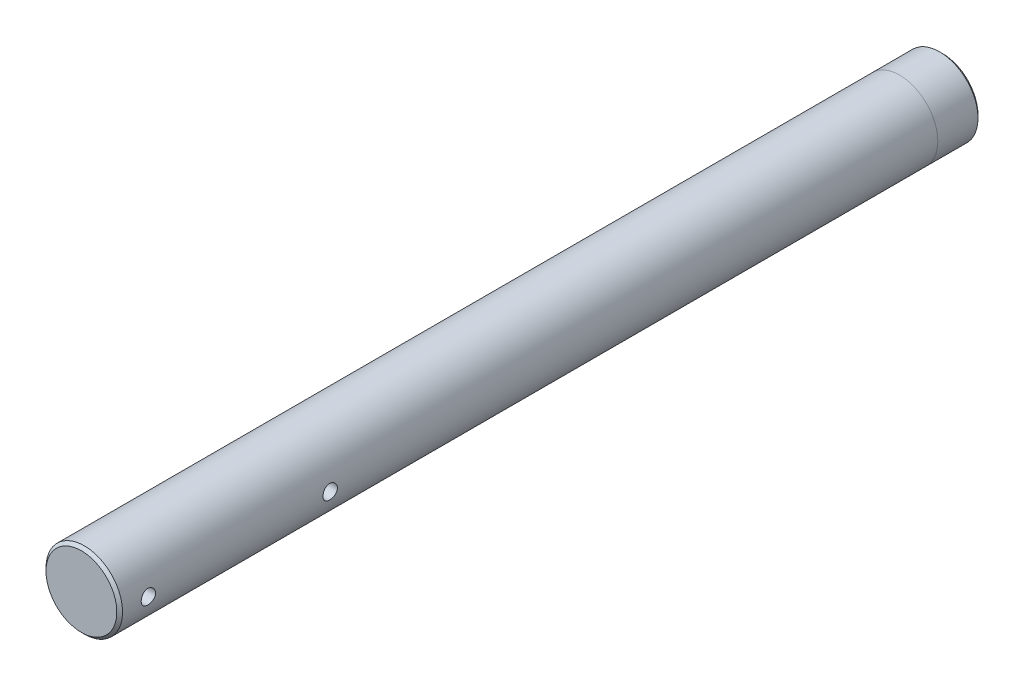
ISO-10303-21;
HEADER;
FILE_DESCRIPTION(('STEP AP214'),'2;1');
FILE_NAME('part.step','',(''),(''),'','','');
FILE_SCHEMA(('AUTOMOTIVE_DESIGN { 1 0 10303 214 1 1 1 1 }'));
ENDSEC;
DATA;
#1=APPLICATION_CONTEXT('core data for automotive mechanical design processes');
#2=APPLICATION_PROTOCOL_DEFINITION('international standard','automotive_design',2000,#1);
#3=PRODUCT_CONTEXT('',#1,'mechanical');
#4=PRODUCT('Part','Part','',(#3));
#5=PRODUCT_RELATED_PRODUCT_CATEGORY('part','',(#4));
#6=PRODUCT_DEFINITION_FORMATION('','',#4);
#7=PRODUCT_DEFINITION_CONTEXT('part definition',#1,'design');
#8=PRODUCT_DEFINITION('design','',#6,#7);
#9=PRODUCT_DEFINITION_SHAPE('','',#8);
#10=(LENGTH_UNIT() NAMED_UNIT(*) SI_UNIT(.MILLI.,.METRE.));
#11=(NAMED_UNIT(*) PLANE_ANGLE_UNIT() SI_UNIT($,.RADIAN.));
#12=(NAMED_UNIT(*) SI_UNIT($,.STERADIAN.) SOLID_ANGLE_UNIT());
#13=UNCERTAINTY_MEASURE_WITH_UNIT(LENGTH_MEASURE(1.E-05),#10,'distance_accuracy_value','');
#14=(GEOMETRIC_REPRESENTATION_CONTEXT(3) GLOBAL_UNCERTAINTY_ASSIGNED_CONTEXT((#13)) GLOBAL_UNIT_ASSIGNED_CONTEXT((#10,
#11,#12)) REPRESENTATION_CONTEXT('',''));
#15=CARTESIAN_POINT('',(0.,0.,0.));
#16=DIRECTION('',(0.,0.,1.));
#17=DIRECTION('',(1.,0.,0.));
#18=AXIS2_PLACEMENT_3D('',#15,#16,#17);
#19=CARTESIAN_POINT('',(0.,0.,0.));
#20=DIRECTION('',(0.,0.,1.));
#21=DIRECTION('',(1.,0.,0.));
#22=AXIS2_PLACEMENT_3D('',#19,#20,#21);
#23=CYLINDRICAL_SURFACE('',#22,4.00000000000001);
#24=CARTESIAN_POINT('',(0.,0.,44.7));
#25=DIRECTION('',(0.,0.,-1.));
#26=DIRECTION('',(-1.,0.,0.));
#27=AXIS2_PLACEMENT_3D('',#24,#25,#26);
#28=CIRCLE('',#27,4.00000000000001);
#29=CARTESIAN_POINT('',(-4.00000000000001,0.,44.7));
#30=VERTEX_POINT('',#29);
#31=EDGE_CURVE('E99',#30,#30,#28,.T.);
#32=ORIENTED_EDGE('',*,*,#31,.T.);
#33=EDGE_LOOP('',(#32));
#34=FACE_BOUND('',#33,.T.);
#35=CARTESIAN_POINT('',(4.00000000000001,0.,22.25));
#36=CARTESIAN_POINT('',(3.99999924416926,-0.0417358732327353,22.2500015947941));
#37=CARTESIAN_POINT('',(3.99934004960858,-0.0834924963650491,22.2534955383097));
#38=CARTESIAN_POINT('',(3.99677392945261,-0.165829064920898,22.2673699975592));
#39=CARTESIAN_POINT('',(3.99486595083449,-0.206407987076112,22.2777563253199));
#40=CARTESIAN_POINT('',(3.9900156938273,-0.2851864809259,22.3050863506297));
#41=CARTESIAN_POINT('',(3.98707434973242,-0.323388165342672,22.3220241262263));
#42=CARTESIAN_POINT('',(3.98047855299892,-0.396403986547004,22.3619594384614));
#43=CARTESIAN_POINT('',(3.97682415809145,-0.431218397238661,22.3849564845724));
#44=CARTESIAN_POINT('',(3.96915668215253,-0.49689185796525,22.4366498840018));
#45=CARTESIAN_POINT('',(3.96514017428176,-0.527704477515915,22.4654047223351));
#46=CARTESIAN_POINT('',(3.95722659229326,-0.584098030676846,22.5276716545438));
#47=CARTESIAN_POINT('',(3.95332952677264,-0.609678588446208,22.5611840898846));
#48=CARTESIAN_POINT('',(3.94606275622503,-0.655074993328966,22.632343044182));
#49=CARTESIAN_POINT('',(3.94269746943092,-0.67484360984803,22.6700201851586));
#50=CARTESIAN_POINT('',(3.93692356605994,-0.70775262166142,22.7482344575884));
#51=CARTESIAN_POINT('',(3.93451486698482,-0.720893588565495,22.7887713420556));
#52=CARTESIAN_POINT('',(3.93096134787275,-0.740025267517506,22.8710576154572));
#53=CARTESIAN_POINT('',(3.92980222683203,-0.7460969509602,22.9127875486017));
#54=CARTESIAN_POINT('',(3.92883598576381,-0.751169040476738,22.9966886924041));
#55=CARTESIAN_POINT('',(3.9290287444938,-0.750170080676877,23.0388598631511));
#56=CARTESIAN_POINT('',(3.93073146350877,-0.74119489801182,23.121859762633));
#57=CARTESIAN_POINT('',(3.93222404073667,-0.733310749980232,23.1626988571501));
#58=CARTESIAN_POINT('',(3.93633091642334,-0.710933996981044,23.2424642098913));
#59=CARTESIAN_POINT('',(3.93894526254758,-0.696441111197507,23.2813903867546));
#60=CARTESIAN_POINT('',(3.94501927646295,-0.66116823589651,23.3564943395001));
#61=CARTESIAN_POINT('',(3.94848391911683,-0.640351067662291,23.3926542352904));
#62=CARTESIAN_POINT('',(3.95586485801459,-0.593046844652095,23.4610023642701));
#63=CARTESIAN_POINT('',(3.95978120007761,-0.566559214446343,23.4931901938574));
#64=CARTESIAN_POINT('',(3.96770000636083,-0.508169528426502,23.5532124778362));
#65=CARTESIAN_POINT('',(3.97170285512016,-0.476188718430355,23.5809703262259));
#66=CARTESIAN_POINT('',(3.97928693054159,-0.407984018549427,23.6307386203377));
#67=CARTESIAN_POINT('',(3.98286815297623,-0.371760086127899,23.6527490084352));
#68=CARTESIAN_POINT('',(3.98921269838755,-0.296017494437348,23.690408876935));
#69=CARTESIAN_POINT('',(3.99197499568145,-0.256494782223261,23.7060503895589));
#70=CARTESIAN_POINT('',(3.9963625270136,-0.175319557699363,23.7304510465461));
#71=CARTESIAN_POINT('',(3.99798788183997,-0.13366727213891,23.7392109220227));
#72=CARTESIAN_POINT('',(3.99990180320991,-0.0500743264517097,23.7494930155091));
#73=CARTESIAN_POINT('',(4.0002097545614,-0.00814700631708466,23.7511201957649));
#74=CARTESIAN_POINT('',(3.99950771799115,0.075380624046075,23.7473722602262));
#75=CARTESIAN_POINT('',(3.99849779482216,0.116980950240176,23.7419974884674));
#76=CARTESIAN_POINT('',(3.99528555750204,0.198340786609091,23.7244854824083));
#77=CARTESIAN_POINT('',(3.99309261187016,0.238112130523015,23.7124013587311));
#78=CARTESIAN_POINT('',(3.9877592110625,0.3150643159123,23.6818711466106));
#79=CARTESIAN_POINT('',(3.98461869155668,0.352244981297535,23.6634246262171));
#80=CARTESIAN_POINT('',(3.97769015178834,0.423408335756591,23.6204609359202));
#81=CARTESIAN_POINT('',(3.97389543087282,0.457351638507544,23.5958796307316));
#82=CARTESIAN_POINT('',(3.96609671744856,0.520669161632256,23.5414309313188));
#83=CARTESIAN_POINT('',(3.96209270542344,0.550042954880417,23.5115630434993));
#84=CARTESIAN_POINT('',(3.95426237848726,0.603786479360223,23.4469138405443));
#85=CARTESIAN_POINT('',(3.95043912930129,0.628084581092866,23.4120725459373));
#86=CARTESIAN_POINT('',(3.94346492789267,0.670483375288918,23.3387411877381));
#87=CARTESIAN_POINT('',(3.94031395068676,0.688584298069606,23.3002512598148));
#88=CARTESIAN_POINT('',(3.93506512104787,0.717973367564102,23.2208970663787));
#89=CARTESIAN_POINT('',(3.9329622021844,0.729294343973919,23.1800453102203));
#90=CARTESIAN_POINT('',(3.93003601901208,0.744903396631166,23.0969763887393));
#91=CARTESIAN_POINT('',(3.92921261032896,0.74919226635353,23.0547593780148));
#92=CARTESIAN_POINT('',(3.92894599901929,0.750588810741764,22.9708758342793));
#93=CARTESIAN_POINT('',(3.92948107987147,0.747809475017485,22.9292112095215));
#94=CARTESIAN_POINT('',(3.9318230033,0.735395876894007,22.8469542889774));
#95=CARTESIAN_POINT('',(3.93362983827874,0.725761655446653,22.8063619867863));
#96=CARTESIAN_POINT('',(3.9383025401159,0.699959437916309,22.7274627576023));
#97=CARTESIAN_POINT('',(3.94116642297483,0.683803676986256,22.6891517043271));
#98=CARTESIAN_POINT('',(3.94763193775921,0.645429344561017,22.6157658728796));
#99=CARTESIAN_POINT('',(3.9512336218006,0.623210344740925,22.5806913235776));
#100=CARTESIAN_POINT('',(3.95883633053873,0.572947436697672,22.5142081599789));
#101=CARTESIAN_POINT('',(3.96284252676522,0.544821299321514,22.4828622937165));
#102=CARTESIAN_POINT('',(3.97076416959368,0.483713963371142,22.4252974187677));
#103=CARTESIAN_POINT('',(3.97467959513665,0.450731650945804,22.3990795895099));
#104=CARTESIAN_POINT('',(3.98201987984025,0.380492472535933,22.3522945236865));
#105=CARTESIAN_POINT('',(3.98544000495281,0.343199795320257,22.3317802857547));
#106=CARTESIAN_POINT('',(3.99135809690344,0.265645056826917,22.2973411816974));
#107=CARTESIAN_POINT('',(3.99385692939519,0.225385825852624,22.2834101264766));
#108=CARTESIAN_POINT('',(3.99714145353817,0.154173601412577,22.2653613427907));
#109=CARTESIAN_POINT('',(3.99820735439104,0.123636905125935,22.2596106848436));
#110=CARTESIAN_POINT('',(3.99963689977006,0.062070623557579,22.2519294689418));
#111=CARTESIAN_POINT('',(4.00000056214903,0.0310410508263548,22.2499988138721));
#112=CARTESIAN_POINT('',(4.00000000000001,0.,22.25));
#113=B_SPLINE_CURVE_WITH_KNOTS('',3,(#35,#36,#37,#38,#39,#40,#41,#42,#43,#44,#45,#46,#47,#48,
#49,#50,#51,#52,#53,#54,#55,#56,#57,#58,#59,#60,#61,#62,#63,#64,#65,#66,#67,#68,#69,#70,#71,#72,
#73,#74,#75,#76,#77,#78,#79,#80,#81,#82,#83,#84,#85,#86,#87,#88,#89,#90,#91,#92,#93,#94,#95,#96,
#97,#98,#99,#100,#101,#102,#103,#104,#105,#106,#107,#108,#109,#110,#111,#112),.UNSPECIFIED.,.T.,
.F.,(4,2,2,2,2,2,2,2,2,2,2,2,2,2,2,2,2,2,2,2,2,2,2,2,2,2,2,2,2,2,2,2,2,2,2,2,2,2,4),(0.,
0.125094100482461,0.250293821267725,0.375380635615452,0.500457326684451,0.626875590068147,
0.75330293141808,0.880730952521787,1.00814798155974,1.13409075722667,1.26002223793628,
1.38429500306382,1.50857304923393,1.63359631314764,1.75863227024929,1.88563884232038,
2.01264668772474,2.13981294160849,2.26696568336872,2.39224087038048,2.51750990232291,
2.64180116953913,2.76610087669015,2.89175889008853,3.01742864206548,3.14476718493648,
3.27210099477471,3.39881313909278,3.52551098473255,3.65019626115873,3.77488079270752,
3.89933248103845,4.0237929632771,4.15011684983189,4.27646975631127,4.40396024458156,
4.53133063465585,4.62437172262203,4.71741044519769),.UNSPECIFIED.);
#114=CARTESIAN_POINT('',(4.00000000000001,0.,22.25));
#115=VERTEX_POINT('',#114);
#116=EDGE_CURVE('E76',#115,#115,#113,.T.);
#117=ORIENTED_EDGE('',*,*,#116,.T.);
#118=EDGE_LOOP('',(#117));
#119=FACE_BOUND('',#118,.T.);
#120=CARTESIAN_POINT('',(-4.00000000000001,0.,22.25));
#121=CARTESIAN_POINT('',(-3.99999924416926,0.041735873232727,22.2500015947941));
#122=CARTESIAN_POINT('',(-3.99934004960858,0.0834924963650405,22.2534955383097));
#123=CARTESIAN_POINT('',(-3.99677392945261,0.16582906492089,22.2673699975592));
#124=CARTESIAN_POINT('',(-3.99486595083449,0.206407987076104,22.2777563253199));
#125=CARTESIAN_POINT('',(-3.9900156938273,0.285186480925891,22.3050863506297));
#126=CARTESIAN_POINT('',(-3.98707434973242,0.323388165342662,22.3220241262263));
#127=CARTESIAN_POINT('',(-3.98047855299892,0.396403986546993,22.3619594384614));
#128=CARTESIAN_POINT('',(-3.97682415809145,0.431218397238652,22.3849564845724));
#129=CARTESIAN_POINT('',(-3.96915668215253,0.496891857965241,22.4366498840018));
#130=CARTESIAN_POINT('',(-3.96514017428176,0.527704477515905,22.4654047223351));
#131=CARTESIAN_POINT('',(-3.95722659229326,0.584098030676835,22.5276716545438));
#132=CARTESIAN_POINT('',(-3.95332952677264,0.609678588446196,22.5611840898846));
#133=CARTESIAN_POINT('',(-3.94606275622503,0.655074993328953,22.632343044182));
#134=CARTESIAN_POINT('',(-3.94269746943092,0.674843609848016,22.6700201851586));
#135=CARTESIAN_POINT('',(-3.93692356605994,0.707752621661405,22.7482344575884));
#136=CARTESIAN_POINT('',(-3.93451486698482,0.72089358856548,22.7887713420556));
#137=CARTESIAN_POINT('',(-3.93096134787276,0.74002526751749,22.8710576154572));
#138=CARTESIAN_POINT('',(-3.92980222683203,0.746096950960185,22.9127875486017));
#139=CARTESIAN_POINT('',(-3.92883598576381,0.751169040476722,22.9966886924041));
#140=CARTESIAN_POINT('',(-3.92902874449381,0.75017008067686,23.0388598631511));
#141=CARTESIAN_POINT('',(-3.93073146350877,0.741194898011802,23.121859762633));
#142=CARTESIAN_POINT('',(-3.93222404073668,0.733310749980214,23.1626988571501));
#143=CARTESIAN_POINT('',(-3.93633091642334,0.710933996981024,23.2424642098913));
#144=CARTESIAN_POINT('',(-3.93894526254759,0.696441111197486,23.2813903867547));
#145=CARTESIAN_POINT('',(-3.94501927646295,0.661168235896488,23.3564943395001));
#146=CARTESIAN_POINT('',(-3.94848391911684,0.640351067662268,23.3926542352904));
#147=CARTESIAN_POINT('',(-3.9558648580146,0.59304684465207,23.4610023642701));
#148=CARTESIAN_POINT('',(-3.95978120007762,0.566559214446319,23.4931901938574));
#149=CARTESIAN_POINT('',(-3.96770000636083,0.508169528426478,23.5532124778362));
#150=CARTESIAN_POINT('',(-3.97170285512016,0.476188718430331,23.5809703262259));
#151=CARTESIAN_POINT('',(-3.9792869305416,0.407984018549403,23.6307386203377));
#152=CARTESIAN_POINT('',(-3.98286815297623,0.371760086127875,23.6527490084352));
#153=CARTESIAN_POINT('',(-3.98921269838755,0.296017494437324,23.690408876935));
#154=CARTESIAN_POINT('',(-3.99197499568145,0.256494782223237,23.7060503895589));
#155=CARTESIAN_POINT('',(-3.9963625270136,0.175319557699339,23.7304510465461));
#156=CARTESIAN_POINT('',(-3.99798788183998,0.133667272138885,23.7392109220227));
#157=CARTESIAN_POINT('',(-3.99990180320991,0.0500743264516851,23.7494930155091));
#158=CARTESIAN_POINT('',(-4.0002097545614,0.00814700631706018,23.7511201957649));
#159=CARTESIAN_POINT('',(-3.99950771799115,-0.0753806240460993,23.7473722602262));
#160=CARTESIAN_POINT('',(-3.99849779482216,-0.1169809502402,23.7419974884674));
#161=CARTESIAN_POINT('',(-3.99528555750204,-0.198340786609116,23.7244854824083));
#162=CARTESIAN_POINT('',(-3.99309261187016,-0.238112130523039,23.7124013587311));
#163=CARTESIAN_POINT('',(-3.9877592110625,-0.315064315912323,23.6818711466106));
#164=CARTESIAN_POINT('',(-3.98461869155668,-0.352244981297559,23.6634246262171));
#165=CARTESIAN_POINT('',(-3.97769015178834,-0.423408335756614,23.6204609359202));
#166=CARTESIAN_POINT('',(-3.97389543087282,-0.457351638507566,23.5958796307316));
#167=CARTESIAN_POINT('',(-3.96609671744856,-0.520669161632278,23.5414309313188));
#168=CARTESIAN_POINT('',(-3.96209270542344,-0.550042954880439,23.5115630434993));
#169=CARTESIAN_POINT('',(-3.95426237848726,-0.603786479360245,23.4469138405443));
#170=CARTESIAN_POINT('',(-3.95043912930129,-0.628084581092889,23.4120725459373));
#171=CARTESIAN_POINT('',(-3.94346492789266,-0.67048337528894,23.3387411877381));
#172=CARTESIAN_POINT('',(-3.94031395068675,-0.688584298069627,23.3002512598148));
#173=CARTESIAN_POINT('',(-3.93506512104787,-0.717973367564122,23.2208970663787));
#174=CARTESIAN_POINT('',(-3.93296220218439,-0.729294343973938,23.1800453102203));
#175=CARTESIAN_POINT('',(-3.93003601901208,-0.744903396631184,23.0969763887393));
#176=CARTESIAN_POINT('',(-3.92921261032895,-0.749192266353548,23.0547593780148));
#177=CARTESIAN_POINT('',(-3.92894599901929,-0.75058881074178,22.9708758342792));
#178=CARTESIAN_POINT('',(-3.92948107987147,-0.747809475017501,22.9292112095215));
#179=CARTESIAN_POINT('',(-3.9318230033,-0.735395876894021,22.8469542889774));
#180=CARTESIAN_POINT('',(-3.93362983827874,-0.725761655446666,22.8063619867863));
#181=CARTESIAN_POINT('',(-3.9383025401159,-0.699959437916322,22.7274627576023));
#182=CARTESIAN_POINT('',(-3.94116642297483,-0.683803676986268,22.6891517043271));
#183=CARTESIAN_POINT('',(-3.9476319377592,-0.645429344561028,22.6157658728796));
#184=CARTESIAN_POINT('',(-3.9512336218006,-0.623210344740936,22.5806913235776));
#185=CARTESIAN_POINT('',(-3.95883633053873,-0.572947436697683,22.5142081599789));
#186=CARTESIAN_POINT('',(-3.96284252676522,-0.544821299321525,22.4828622937165));
#187=CARTESIAN_POINT('',(-3.97076416959368,-0.483713963371152,22.4252974187677));
#188=CARTESIAN_POINT('',(-3.97467959513664,-0.450731650945814,22.3990795895099));
#189=CARTESIAN_POINT('',(-3.98201987984025,-0.380492472535942,22.3522945236865));
#190=CARTESIAN_POINT('',(-3.98544000495281,-0.343199795320265,22.3317802857547));
#191=CARTESIAN_POINT('',(-3.99135809690344,-0.265645056826924,22.2973411816974));
#192=CARTESIAN_POINT('',(-3.99385692939519,-0.225385825852631,22.2834101264765));
#193=CARTESIAN_POINT('',(-3.99714145353817,-0.154173601412585,22.2653613427907));
#194=CARTESIAN_POINT('',(-3.99820735439104,-0.123636905125943,22.2596106848436));
#195=CARTESIAN_POINT('',(-3.99963689977006,-0.0620706235575874,22.2519294689418));
#196=CARTESIAN_POINT('',(-4.00000056214903,-0.0310410508263631,22.2499988138721));
#197=CARTESIAN_POINT('',(-4.00000000000001,0.,22.25));
#198=B_SPLINE_CURVE_WITH_KNOTS('',3,(#120,#121,#122,#123,#124,#125,#126,#127,#128,#129,#130,
#131,#132,#133,#134,#135,#136,#137,#138,#139,#140,#141,#142,#143,#144,#145,#146,#147,#148,#149,
#150,#151,#152,#153,#154,#155,#156,#157,#158,#159,#160,#161,#162,#163,#164,#165,#166,#167,#168,
#169,#170,#171,#172,#173,#174,#175,#176,#177,#178,#179,#180,#181,#182,#183,#184,#185,#186,#187,
#188,#189,#190,#191,#192,#193,#194,#195,#196,#197),.UNSPECIFIED.,.T.,.F.,(4,2,2,2,2,2,2,2,2,2,2,
2,2,2,2,2,2,2,2,2,2,2,2,2,2,2,2,2,2,2,2,2,2,2,2,2,2,2,4),(0.,0.125094100482462,
0.250293821267724,0.375380635615451,0.500457326684453,0.626875590068148,0.75330293141808,
0.880730952521782,1.00814798155973,1.13409075722668,1.26002223793627,1.38429500306382,
1.50857304923393,1.63359631314765,1.75863227024929,1.88563884232038,2.01264668772473,
2.13981294160849,2.26696568336872,2.39224087038048,2.51750990232291,2.64180116953913,
2.76610087669015,2.89175889008853,3.01742864206548,3.14476718493649,3.27210099477472,
3.39881313909278,3.52551098473255,3.65019626115873,3.77488079270752,3.89933248103845,
4.0237929632771,4.15011684983189,4.27646975631127,4.40396024458156,4.53133063465586,
4.62437172262203,4.71741044519769),.UNSPECIFIED.);
#199=CARTESIAN_POINT('',(-4.00000000000001,0.,22.25));
#200=VERTEX_POINT('',#199);
#201=EDGE_CURVE('E52',#200,#200,#198,.T.);
#202=ORIENTED_EDGE('',*,*,#201,.T.);
#203=EDGE_LOOP('',(#202));
#204=FACE_BOUND('',#203,.T.);
#205=CARTESIAN_POINT('',(4.00000000000001,0.,41.25));
#206=CARTESIAN_POINT('',(3.99999924416926,-0.0417358732327351,41.2500015947941));
#207=CARTESIAN_POINT('',(3.99934004960858,-0.083492496365049,41.2534955383097));
#208=CARTESIAN_POINT('',(3.99677392945261,-0.165829064920898,41.2673699975592));
#209=CARTESIAN_POINT('',(3.99486595083449,-0.206407987076112,41.2777563253199));
#210=CARTESIAN_POINT('',(3.99001569382729,-0.2851864809259,41.3050863506297));
#211=CARTESIAN_POINT('',(3.98707434973242,-0.323388165342672,41.3220241262263));
#212=CARTESIAN_POINT('',(3.98047855299892,-0.396403986547004,41.3619594384614));
#213=CARTESIAN_POINT('',(3.97682415809145,-0.431218397238663,41.3849564845724));
#214=CARTESIAN_POINT('',(3.96915668215253,-0.496891857965253,41.4366498840018));
#215=CARTESIAN_POINT('',(3.96514017428176,-0.527704477515917,41.4654047223351));
#216=CARTESIAN_POINT('',(3.95722659229326,-0.584098030676848,41.5276716545438));
#217=CARTESIAN_POINT('',(3.95332952677264,-0.60967858844621,41.5611840898846));
#218=CARTESIAN_POINT('',(3.94606275622503,-0.655074993328968,41.632343044182));
#219=CARTESIAN_POINT('',(3.94269746943092,-0.674843609848031,41.6700201851586));
#220=CARTESIAN_POINT('',(3.93692356605994,-0.707752621661421,41.7482344575884));
#221=CARTESIAN_POINT('',(3.93451486698482,-0.720893588565498,41.7887713420556));
#222=CARTESIAN_POINT('',(3.93096134787275,-0.740025267517509,41.8710576154572));
#223=CARTESIAN_POINT('',(3.92980222683203,-0.746096950960203,41.9127875486017));
#224=CARTESIAN_POINT('',(3.92883598576381,-0.751169040476741,41.9966886924041));
#225=CARTESIAN_POINT('',(3.9290287444938,-0.750170080676879,42.0388598631511));
#226=CARTESIAN_POINT('',(3.93073146350877,-0.741194898011823,42.121859762633));
#227=CARTESIAN_POINT('',(3.93222404073667,-0.733310749980236,42.1626988571501));
#228=CARTESIAN_POINT('',(3.93633091642333,-0.710933996981049,42.2424642098913));
#229=CARTESIAN_POINT('',(3.93894526254758,-0.69644111119751,42.2813903867546));
#230=CARTESIAN_POINT('',(3.94501927646294,-0.661168235896515,42.3564943395001));
#231=CARTESIAN_POINT('',(3.94848391911683,-0.640351067662298,42.3926542352904));
#232=CARTESIAN_POINT('',(3.95586485801459,-0.593046844652102,42.4610023642701));
#233=CARTESIAN_POINT('',(3.95978120007761,-0.56655921444635,42.4931901938574));
#234=CARTESIAN_POINT('',(3.96770000636082,-0.508169528426508,42.5532124778362));
#235=CARTESIAN_POINT('',(3.97170285512016,-0.476188718430362,42.5809703262259));
#236=CARTESIAN_POINT('',(3.97928693054159,-0.407984018549435,42.6307386203377));
#237=CARTESIAN_POINT('',(3.98286815297623,-0.371760086127908,42.6527490084352));
#238=CARTESIAN_POINT('',(3.98921269838755,-0.296017494437356,42.690408876935));
#239=CARTESIAN_POINT('',(3.99197499568145,-0.256494782223268,42.7060503895589));
#240=CARTESIAN_POINT('',(3.9963625270136,-0.175319557699367,42.7304510465461));
#241=CARTESIAN_POINT('',(3.99798788183997,-0.133667272138912,42.7392109220227));
#242=CARTESIAN_POINT('',(3.99990180320991,-0.0500743264517115,42.7494930155091));
#243=CARTESIAN_POINT('',(4.0002097545614,-0.00814700631708711,42.7511201957649));
#244=CARTESIAN_POINT('',(3.99950771799115,0.0753806240460714,42.7473722602262));
#245=CARTESIAN_POINT('',(3.99849779482216,0.116980950240171,42.7419974884674));
#246=CARTESIAN_POINT('',(3.99528555750204,0.198340786609088,42.7244854824083));
#247=CARTESIAN_POINT('',(3.99309261187016,0.238112130523012,42.7124013587311));
#248=CARTESIAN_POINT('',(3.9877592110625,0.315064315912297,42.6818711466106));
#249=CARTESIAN_POINT('',(3.98461869155668,0.352244981297531,42.6634246262171));
#250=CARTESIAN_POINT('',(3.97769015178834,0.423408335756588,42.6204609359202));
#251=CARTESIAN_POINT('',(3.97389543087282,0.457351638507543,42.5958796307316));
#252=CARTESIAN_POINT('',(3.96609671744856,0.520669161632255,42.5414309313188));
#253=CARTESIAN_POINT('',(3.96209270542344,0.550042954880414,42.5115630434993));
#254=CARTESIAN_POINT('',(3.95426237848726,0.603786479360221,42.4469138405443));
#255=CARTESIAN_POINT('',(3.95043912930129,0.628084581092867,42.4120725459373));
#256=CARTESIAN_POINT('',(3.94346492789267,0.67048337528892,42.3387411877381));
#257=CARTESIAN_POINT('',(3.94031395068676,0.688584298069605,42.3002512598148));
#258=CARTESIAN_POINT('',(3.93506512104788,0.7179733675641,42.2208970663787));
#259=CARTESIAN_POINT('',(3.9329622021844,0.729294343973917,42.1800453102203));
#260=CARTESIAN_POINT('',(3.93003601901208,0.744903396631164,42.0969763887393));
#261=CARTESIAN_POINT('',(3.92921261032896,0.749192266353528,42.0547593780148));
#262=CARTESIAN_POINT('',(3.92894599901929,0.750588810741762,41.9708758342792));
#263=CARTESIAN_POINT('',(3.92948107987147,0.747809475017484,41.9292112095215));
#264=CARTESIAN_POINT('',(3.9318230033,0.735395876894005,41.8469542889774));
#265=CARTESIAN_POINT('',(3.93362983827874,0.725761655446651,41.8063619867863));
#266=CARTESIAN_POINT('',(3.93830254011591,0.699959437916308,41.7274627576023));
#267=CARTESIAN_POINT('',(3.94116642297483,0.683803676986255,41.6891517043271));
#268=CARTESIAN_POINT('',(3.94763193775921,0.645429344561017,41.6157658728796));
#269=CARTESIAN_POINT('',(3.9512336218006,0.623210344740925,41.5806913235776));
#270=CARTESIAN_POINT('',(3.95883633053873,0.572947436697673,41.5142081599789));
#271=CARTESIAN_POINT('',(3.96284252676522,0.544821299321515,41.4828622937165));
#272=CARTESIAN_POINT('',(3.97076416959368,0.483713963371144,41.4252974187677));
#273=CARTESIAN_POINT('',(3.97467959513665,0.450731650945807,41.3990795895099));
#274=CARTESIAN_POINT('',(3.98201987984025,0.380492472535936,41.3522945236865));
#275=CARTESIAN_POINT('',(3.98544000495281,0.343199795320257,41.3317802857547));
#276=CARTESIAN_POINT('',(3.99135809690344,0.265645056826916,41.2973411816974));
#277=CARTESIAN_POINT('',(3.99385692939519,0.225385825852624,41.2834101264765));
#278=CARTESIAN_POINT('',(3.99714145353817,0.154173601412578,41.2653613427907));
#279=CARTESIAN_POINT('',(3.99820735439104,0.123636905125936,41.2596106848436));
#280=CARTESIAN_POINT('',(3.99963689977006,0.0620706235575793,41.2519294689418));
#281=CARTESIAN_POINT('',(4.00000056214903,0.031041050826355,41.249998813872));
#282=CARTESIAN_POINT('',(4.00000000000001,0.,41.25));
#283=B_SPLINE_CURVE_WITH_KNOTS('',3,(#205,#206,#207,#208,#209,#210,#211,#212,#213,#214,#215,
#216,#217,#218,#219,#220,#221,#222,#223,#224,#225,#226,#227,#228,#229,#230,#231,#232,#233,#234,
#235,#236,#237,#238,#239,#240,#241,#242,#243,#244,#245,#246,#247,#248,#249,#250,#251,#252,#253,
#254,#255,#256,#257,#258,#259,#260,#261,#262,#263,#264,#265,#266,#267,#268,#269,#270,#271,#272,
#273,#274,#275,#276,#277,#278,#279,#280,#281,#282),.UNSPECIFIED.,.T.,.F.,(4,2,2,2,2,2,2,2,2,2,2,
2,2,2,2,2,2,2,2,2,2,2,2,2,2,2,2,2,2,2,2,2,2,2,2,2,2,2,4),(0.,0.125094100482461,
0.250293821267726,0.375380635615456,0.500457326684451,0.62687559006815,0.753302931418083,
0.88073095252179,1.00814798155974,1.13409075722668,1.26002223793628,1.38429500306382,
1.50857304923393,1.63359631314764,1.75863227024929,1.88563884232038,2.01264668772473,
2.13981294160849,2.26696568336873,2.39224087038048,2.51750990232291,2.64180116953914,
2.76610087669015,2.89175889008854,3.01742864206548,3.1447671849365,3.27210099477472,
3.39881313909279,3.52551098473256,3.65019626115873,3.77488079270753,3.89933248103845,
4.0237929632771,4.15011684983189,4.27646975631126,4.40396024458157,4.53133063465586,
4.62437172262204,4.71741044519769),.UNSPECIFIED.);
#284=CARTESIAN_POINT('',(4.00000000000001,0.,41.25));
#285=VERTEX_POINT('',#284);
#286=EDGE_CURVE('E48',#285,#285,#283,.T.);
#287=ORIENTED_EDGE('',*,*,#286,.T.);
#288=EDGE_LOOP('',(#287));
#289=FACE_BOUND('',#288,.T.);
#290=CARTESIAN_POINT('',(-4.00000000000001,0.,41.25));
#291=CARTESIAN_POINT('',(-3.99999924416926,0.0417358732327248,41.2500015947941));
#292=CARTESIAN_POINT('',(-3.99934004960858,0.0834924963650386,41.2534955383097));
#293=CARTESIAN_POINT('',(-3.99677392945261,0.165829064920888,41.2673699975592));
#294=CARTESIAN_POINT('',(-3.99486595083449,0.206407987076102,41.2777563253199));
#295=CARTESIAN_POINT('',(-3.9900156938273,0.285186480925891,41.3050863506297));
#296=CARTESIAN_POINT('',(-3.98707434973242,0.323388165342664,41.3220241262263));
#297=CARTESIAN_POINT('',(-3.98047855299892,0.396403986546995,41.3619594384614));
#298=CARTESIAN_POINT('',(-3.97682415809146,0.431218397238652,41.3849564845724));
#299=CARTESIAN_POINT('',(-3.96915668215253,0.496891857965241,41.4366498840018));
#300=CARTESIAN_POINT('',(-3.96514017428176,0.527704477515906,41.4654047223351));
#301=CARTESIAN_POINT('',(-3.95722659229326,0.584098030676836,41.5276716545438));
#302=CARTESIAN_POINT('',(-3.95332952677264,0.609678588446197,41.5611840898846));
#303=CARTESIAN_POINT('',(-3.94606275622504,0.655074993328953,41.632343044182));
#304=CARTESIAN_POINT('',(-3.94269746943092,0.674843609848014,41.6700201851586));
#305=CARTESIAN_POINT('',(-3.93692356605994,0.707752621661403,41.7482344575884));
#306=CARTESIAN_POINT('',(-3.93451486698482,0.720893588565479,41.7887713420556));
#307=CARTESIAN_POINT('',(-3.93096134787276,0.740025267517489,41.8710576154572));
#308=CARTESIAN_POINT('',(-3.92980222683203,0.746096950960183,41.9127875486017));
#309=CARTESIAN_POINT('',(-3.92883598576381,0.75116904047672,41.9966886924041));
#310=CARTESIAN_POINT('',(-3.92902874449381,0.750170080676858,42.0388598631511));
#311=CARTESIAN_POINT('',(-3.93073146350877,0.7411948980118,42.121859762633));
#312=CARTESIAN_POINT('',(-3.93222404073668,0.733310749980212,42.1626988571501));
#313=CARTESIAN_POINT('',(-3.93633091642334,0.710933996981021,42.2424642098913));
#314=CARTESIAN_POINT('',(-3.93894526254759,0.696441111197483,42.2813903867546));
#315=CARTESIAN_POINT('',(-3.94501927646295,0.661168235896486,42.3564943395001));
#316=CARTESIAN_POINT('',(-3.94848391911684,0.640351067662268,42.3926542352904));
#317=CARTESIAN_POINT('',(-3.9558648580146,0.59304684465207,42.4610023642701));
#318=CARTESIAN_POINT('',(-3.95978120007762,0.566559214446317,42.4931901938574));
#319=CARTESIAN_POINT('',(-3.96770000636083,0.508169528426474,42.5532124778362));
#320=CARTESIAN_POINT('',(-3.97170285512016,0.476188718430327,42.5809703262259));
#321=CARTESIAN_POINT('',(-3.9792869305416,0.407984018549401,42.6307386203377));
#322=CARTESIAN_POINT('',(-3.98286815297623,0.371760086127874,42.6527490084352));
#323=CARTESIAN_POINT('',(-3.98921269838755,0.296017494437323,42.690408876935));
#324=CARTESIAN_POINT('',(-3.99197499568145,0.256494782223234,42.7060503895589));
#325=CARTESIAN_POINT('',(-3.9963625270136,0.175319557699335,42.7304510465461));
#326=CARTESIAN_POINT('',(-3.99798788183998,0.13366727213888,42.7392109220227));
#327=CARTESIAN_POINT('',(-3.99990180320991,0.0500743264516794,42.7494930155091));
#328=CARTESIAN_POINT('',(-4.0002097545614,0.00814700631705442,42.7511201957649));
#329=CARTESIAN_POINT('',(-3.99950771799115,-0.0753806240461047,42.7473722602262));
#330=CARTESIAN_POINT('',(-3.99849779482216,-0.116980950240205,42.7419974884674));
#331=CARTESIAN_POINT('',(-3.99528555750204,-0.19834078660912,42.7244854824083));
#332=CARTESIAN_POINT('',(-3.99309261187016,-0.238112130523044,42.7124013587311));
#333=CARTESIAN_POINT('',(-3.9877592110625,-0.315064315912328,42.6818711466106));
#334=CARTESIAN_POINT('',(-3.98461869155668,-0.352244981297561,42.6634246262171));
#335=CARTESIAN_POINT('',(-3.97769015178833,-0.423408335756616,42.6204609359202));
#336=CARTESIAN_POINT('',(-3.97389543087282,-0.457351638507571,42.5958796307316));
#337=CARTESIAN_POINT('',(-3.96609671744856,-0.520669161632284,42.5414309313188));
#338=CARTESIAN_POINT('',(-3.96209270542344,-0.550042954880444,42.5115630434993));
#339=CARTESIAN_POINT('',(-3.95426237848726,-0.603786479360248,42.4469138405443));
#340=CARTESIAN_POINT('',(-3.95043912930129,-0.628084581092891,42.4120725459373));
#341=CARTESIAN_POINT('',(-3.94346492789266,-0.670483375288943,42.3387411877381));
#342=CARTESIAN_POINT('',(-3.94031395068675,-0.68858429806963,42.3002512598148));
#343=CARTESIAN_POINT('',(-3.93506512104787,-0.717973367564125,42.2208970663787));
#344=CARTESIAN_POINT('',(-3.93296220218439,-0.729294343973941,42.1800453102203));
#345=CARTESIAN_POINT('',(-3.93003601901208,-0.744903396631187,42.0969763887393));
#346=CARTESIAN_POINT('',(-3.92921261032895,-0.74919226635355,42.0547593780148));
#347=CARTESIAN_POINT('',(-3.92894599901929,-0.750588810741782,41.9708758342792));
#348=CARTESIAN_POINT('',(-3.92948107987147,-0.747809475017504,41.9292112095215));
#349=CARTESIAN_POINT('',(-3.9318230033,-0.735395876894025,41.8469542889774));
#350=CARTESIAN_POINT('',(-3.93362983827874,-0.72576165544667,41.8063619867863));
#351=CARTESIAN_POINT('',(-3.9383025401159,-0.699959437916325,41.7274627576023));
#352=CARTESIAN_POINT('',(-3.94116642297483,-0.683803676986272,41.6891517043271));
#353=CARTESIAN_POINT('',(-3.9476319377592,-0.645429344561032,41.6157658728796));
#354=CARTESIAN_POINT('',(-3.9512336218006,-0.62321034474094,41.5806913235776));
#355=CARTESIAN_POINT('',(-3.95883633053873,-0.572947436697688,41.5142081599789));
#356=CARTESIAN_POINT('',(-3.96284252676522,-0.544821299321529,41.4828622937165));
#357=CARTESIAN_POINT('',(-3.97076416959368,-0.483713963371157,41.4252974187677));
#358=CARTESIAN_POINT('',(-3.97467959513664,-0.45073165094582,41.3990795895099));
#359=CARTESIAN_POINT('',(-3.98201987984025,-0.380492472535947,41.3522945236865));
#360=CARTESIAN_POINT('',(-3.98544000495281,-0.343199795320268,41.3317802857547));
#361=CARTESIAN_POINT('',(-3.99135809690344,-0.265645056826927,41.2973411816974));
#362=CARTESIAN_POINT('',(-3.99385692939519,-0.225385825852635,41.2834101264765));
#363=CARTESIAN_POINT('',(-3.99714145353817,-0.154173601412589,41.2653613427907));
#364=CARTESIAN_POINT('',(-3.99820735439104,-0.123636905125947,41.2596106848436));
#365=CARTESIAN_POINT('',(-3.99963689977006,-0.0620706235575904,41.2519294689418));
#366=CARTESIAN_POINT('',(-4.00000056214903,-0.0310410508263657,41.249998813872));
#367=CARTESIAN_POINT('',(-4.00000000000001,0.,41.25));
#368=B_SPLINE_CURVE_WITH_KNOTS('',3,(#290,#291,#292,#293,#294,#295,#296,#297,#298,#299,#300,
#301,#302,#303,#304,#305,#306,#307,#308,#309,#310,#311,#312,#313,#314,#315,#316,#317,#318,#319,
#320,#321,#322,#323,#324,#325,#326,#327,#328,#329,#330,#331,#332,#333,#334,#335,#336,#337,#338,
#339,#340,#341,#342,#343,#344,#345,#346,#347,#348,#349,#350,#351,#352,#353,#354,#355,#356,#357,
#358,#359,#360,#361,#362,#363,#364,#365,#366,#367),.UNSPECIFIED.,.T.,.F.,(4,2,2,2,2,2,2,2,2,2,2,
2,2,2,2,2,2,2,2,2,2,2,2,2,2,2,2,2,2,2,2,2,2,2,2,2,2,2,4),(0.,0.125094100482462,
0.250293821267726,0.375380635615455,0.500457326684457,0.626875590068156,0.753302931418081,
0.880730952521786,1.00814798155974,1.13409075722668,1.26002223793628,1.38429500306383,
1.50857304923393,1.63359631314765,1.7586322702493,1.88563884232038,2.01264668772473,
2.13981294160849,2.26696568336872,2.39224087038048,2.51750990232291,2.64180116953914,
2.76610087669015,2.89175889008854,3.01742864206549,3.14476718493648,3.27210099477473,
3.39881313909279,3.52551098473256,3.65019626115873,3.77488079270752,3.89933248103846,
4.0237929632771,4.15011684983189,4.27646975631127,4.40396024458156,4.53133063465586,
4.62437172262204,4.71741044519769),.UNSPECIFIED.);
#369=CARTESIAN_POINT('',(-4.00000000000001,0.,41.25));
#370=VERTEX_POINT('',#369);
#371=EDGE_CURVE('E42',#370,#370,#368,.T.);
#372=ORIENTED_EDGE('',*,*,#371,.T.);
#373=EDGE_LOOP('',(#372));
#374=FACE_BOUND('',#373,.T.);
#375=CARTESIAN_POINT('',(0.,0.,-40.5));
#376=DIRECTION('',(0.,0.,-1.));
#377=DIRECTION('',(-1.,0.,0.));
#378=AXIS2_PLACEMENT_3D('',#375,#376,#377);
#379=CIRCLE('',#378,4.00000000000001);
#380=CARTESIAN_POINT('',(-4.00000000000001,0.,-40.5));
#381=VERTEX_POINT('',#380);
#382=EDGE_CURVE('E10',#381,#381,#379,.T.);
#383=ORIENTED_EDGE('',*,*,#382,.F.);
#384=EDGE_LOOP('',(#383));
#385=FACE_BOUND('',#384,.T.);
#386=ADVANCED_FACE('F34',(#34,#119,#204,#289,#374,#385),#23,.T.);
#387=CARTESIAN_POINT('',(0.,4.,45.));
#388=DIRECTION('',(0.,0.,-1.));
#389=DIRECTION('',(-1.,0.,0.));
#390=AXIS2_PLACEMENT_3D('',#387,#388,#389);
#391=PLANE('',#390);
#392=CARTESIAN_POINT('',(0.,0.,45.));
#393=DIRECTION('',(0.,0.,-1.));
#394=DIRECTION('',(-1.,0.,0.));
#395=AXIS2_PLACEMENT_3D('',#392,#393,#394);
#396=CIRCLE('',#395,3.70000000000001);
#397=CARTESIAN_POINT('',(-3.70000000000001,0.,45.));
#398=VERTEX_POINT('',#397);
#399=EDGE_CURVE('E86',#398,#398,#396,.F.);
#400=ORIENTED_EDGE('',*,*,#399,.T.);
#401=EDGE_LOOP('',(#400));
#402=FACE_BOUND('',#401,.T.);
#403=ADVANCED_FACE('F112',(#402),#391,.F.);
#404=CARTESIAN_POINT('',(0.,4.00000000000001,-45.));
#405=DIRECTION('',(0.,0.,1.));
#406=DIRECTION('',(1.,0.,0.));
#407=AXIS2_PLACEMENT_3D('',#404,#405,#406);
#408=PLANE('',#407);
#409=CARTESIAN_POINT('',(0.,0.,-45.));
#410=DIRECTION('',(0.,0.,1.));
#411=DIRECTION('',(1.,0.,0.));
#412=AXIS2_PLACEMENT_3D('',#409,#410,#411);
#413=CIRCLE('',#412,3.70000000000001);
#414=CARTESIAN_POINT('',(3.70000000000001,0.,-45.));
#415=VERTEX_POINT('',#414);
#416=EDGE_CURVE('E90',#415,#415,#413,.F.);
#417=ORIENTED_EDGE('',*,*,#416,.T.);
#418=EDGE_LOOP('',(#417));
#419=FACE_BOUND('',#418,.T.);
#420=ADVANCED_FACE('F118',(#419),#408,.F.);
#421=ORIENTED_EDGE('',*,*,#382,.T.);
#422=EDGE_LOOP('',(#421));
#423=FACE_BOUND('',#422,.T.);
#424=CARTESIAN_POINT('',(0.,0.,-44.7));
#425=DIRECTION('',(0.,0.,1.));
#426=DIRECTION('',(1.,0.,0.));
#427=AXIS2_PLACEMENT_3D('',#424,#425,#426);
#428=CIRCLE('',#427,4.00000000000001);
#429=CARTESIAN_POINT('',(4.00000000000001,0.,-44.7));
#430=VERTEX_POINT('',#429);
#431=EDGE_CURVE('E94',#430,#430,#428,.T.);
#432=ORIENTED_EDGE('',*,*,#431,.T.);
#433=EDGE_LOOP('',(#432));
#434=FACE_BOUND('',#433,.T.);
#435=ADVANCED_FACE('F61',(#423,#434),#23,.T.);
#436=CARTESIAN_POINT('',(0.,0.,-44.7));
#437=DIRECTION('',(0.,0.,1.));
#438=DIRECTION('',(1.,0.,0.));
#439=AXIS2_PLACEMENT_3D('',#436,#437,#438);
#440=CONICAL_SURFACE('',#439,4.00000000000001,0.785398163397451);
#441=ORIENTED_EDGE('',*,*,#416,.F.);
#442=EDGE_LOOP('',(#441));
#443=FACE_BOUND('',#442,.T.);
#444=ORIENTED_EDGE('',*,*,#431,.F.);
#445=EDGE_LOOP('',(#444));
#446=FACE_BOUND('',#445,.T.);
#447=ADVANCED_FACE('F106',(#443,#446),#440,.T.);
#448=CARTESIAN_POINT('',(0.,0.,45.));
#449=DIRECTION('',(0.,0.,-1.));
#450=DIRECTION('',(-1.,0.,0.));
#451=AXIS2_PLACEMENT_3D('',#448,#449,#450);
#452=CONICAL_SURFACE('',#451,3.70000000000001,0.785398163397463);
#453=ORIENTED_EDGE('',*,*,#31,.F.);
#454=EDGE_LOOP('',(#453));
#455=FACE_BOUND('',#454,.T.);
#456=ORIENTED_EDGE('',*,*,#399,.F.);
#457=EDGE_LOOP('',(#456));
#458=FACE_BOUND('',#457,.T.);
#459=ADVANCED_FACE('F36',(#455,#458),#452,.T.);
#460=CARTESIAN_POINT('',(-4.00000000000001,0.,23.));
#461=DIRECTION('',(1.,0.,0.));
#462=DIRECTION('',(0.,0.,-1.));
#463=AXIS2_PLACEMENT_3D('',#460,#461,#462);
#464=CYLINDRICAL_SURFACE('',#463,0.749999999999998);
#465=ORIENTED_EDGE('',*,*,#201,.F.);
#466=EDGE_LOOP('',(#465));
#467=FACE_BOUND('',#466,.T.);
#468=ORIENTED_EDGE('',*,*,#116,.F.);
#469=EDGE_LOOP('',(#468));
#470=FACE_BOUND('',#469,.T.);
#471=ADVANCED_FACE('F68',(#467,#470),#464,.F.);
#472=CARTESIAN_POINT('',(-4.00000000000001,0.,42.));
#473=DIRECTION('',(1.,0.,0.));
#474=DIRECTION('',(0.,0.,-1.));
#475=AXIS2_PLACEMENT_3D('',#472,#473,#474);
#476=CYLINDRICAL_SURFACE('',#475,0.749999999999999);
#477=ORIENTED_EDGE('',*,*,#371,.F.);
#478=EDGE_LOOP('',(#477));
#479=FACE_BOUND('',#478,.T.);
#480=ORIENTED_EDGE('',*,*,#286,.F.);
#481=EDGE_LOOP('',(#480));
#482=FACE_BOUND('',#481,.T.);
#483=ADVANCED_FACE('F65',(#479,#482),#476,.F.);
#484=CLOSED_SHELL('',(#386,#403,#420,#435,#447,#459,#471,#483));
#485=MANIFOLD_SOLID_BREP('B2',#484);
#486=ADVANCED_BREP_SHAPE_REPRESENTATION('',(#18,#485),#14);
#487=SHAPE_DEFINITION_REPRESENTATION(#9,#486);
ENDSEC;
END-ISO-10303-21;
